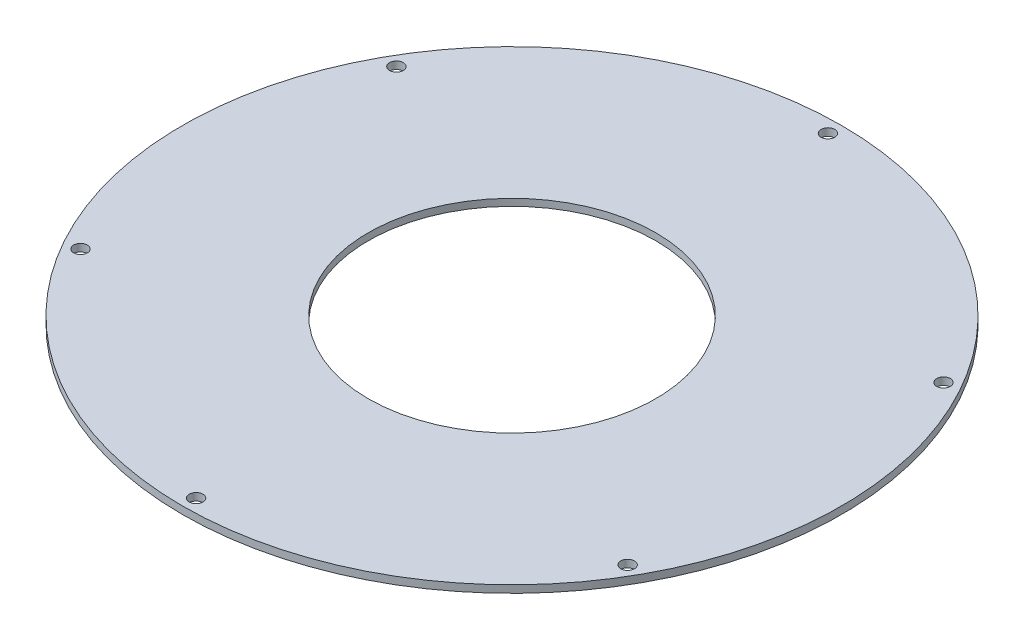
ISO-10303-21;
HEADER;
FILE_DESCRIPTION(('STEP AP214'),'2;1');
FILE_NAME('part.step','',(''),(''),'','','');
FILE_SCHEMA(('AUTOMOTIVE_DESIGN { 1 0 10303 214 1 1 1 1 }'));
ENDSEC;
DATA;
#1=APPLICATION_CONTEXT('core data for automotive mechanical design processes');
#2=APPLICATION_PROTOCOL_DEFINITION('international standard','automotive_design',2000,#1);
#3=PRODUCT_CONTEXT('',#1,'mechanical');
#4=PRODUCT('Part','Part','',(#3));
#5=PRODUCT_RELATED_PRODUCT_CATEGORY('part','',(#4));
#6=PRODUCT_DEFINITION_FORMATION('','',#4);
#7=PRODUCT_DEFINITION_CONTEXT('part definition',#1,'design');
#8=PRODUCT_DEFINITION('design','',#6,#7);
#9=PRODUCT_DEFINITION_SHAPE('','',#8);
#10=(LENGTH_UNIT() NAMED_UNIT(*) SI_UNIT(.MILLI.,.METRE.));
#11=(NAMED_UNIT(*) PLANE_ANGLE_UNIT() SI_UNIT($,.RADIAN.));
#12=(NAMED_UNIT(*) SI_UNIT($,.STERADIAN.) SOLID_ANGLE_UNIT());
#13=UNCERTAINTY_MEASURE_WITH_UNIT(LENGTH_MEASURE(1.E-05),#10,'distance_accuracy_value','');
#14=(GEOMETRIC_REPRESENTATION_CONTEXT(3) GLOBAL_UNCERTAINTY_ASSIGNED_CONTEXT((#13)) GLOBAL_UNIT_ASSIGNED_CONTEXT((#10,
#11,#12)) REPRESENTATION_CONTEXT('',''));
#15=CARTESIAN_POINT('',(0.,0.,0.));
#16=DIRECTION('',(0.,0.,1.));
#17=DIRECTION('',(1.,0.,0.));
#18=AXIS2_PLACEMENT_3D('',#15,#16,#17);
#19=CARTESIAN_POINT('',(0.,0.,0.));
#20=DIRECTION('',(0.,1.,0.));
#21=DIRECTION('',(0.,0.,1.));
#22=AXIS2_PLACEMENT_3D('',#19,#20,#21);
#23=PLANE('',#22);
#24=CARTESIAN_POINT('',(0.,0.,0.));
#25=DIRECTION('',(0.,1.,0.));
#26=DIRECTION('',(0.,0.,1.));
#27=AXIS2_PLACEMENT_3D('',#24,#25,#26);
#28=CIRCLE('',#27,70.8759);
#29=CARTESIAN_POINT('',(0.,0.,70.8759));
#30=VERTEX_POINT('',#29);
#31=EDGE_CURVE('E43',#30,#30,#28,.T.);
#32=ORIENTED_EDGE('',*,*,#31,.F.);
#33=EDGE_LOOP('',(#32));
#34=FACE_BOUND('',#33,.T.);
#35=CARTESIAN_POINT('',(-58.835990581037,0.,-33.968975));
#36=DIRECTION('',(0.,1.,0.));
#37=DIRECTION('',(0.,0.,1.));
#38=AXIS2_PLACEMENT_3D('',#35,#36,#37);
#39=CIRCLE('',#38,1.4732);
#40=CARTESIAN_POINT('',(-58.835990581037,0.,-32.495775));
#41=VERTEX_POINT('',#40);
#42=EDGE_CURVE('E71',#41,#41,#39,.T.);
#43=ORIENTED_EDGE('',*,*,#42,.T.);
#44=EDGE_LOOP('',(#43));
#45=FACE_BOUND('',#44,.T.);
#46=CARTESIAN_POINT('',(-58.835990581037,0.,33.968975));
#47=DIRECTION('',(0.,1.,0.));
#48=DIRECTION('',(0.,0.,1.));
#49=AXIS2_PLACEMENT_3D('',#46,#47,#48);
#50=CIRCLE('',#49,1.4732);
#51=CARTESIAN_POINT('',(-58.835990581037,0.,35.442175));
#52=VERTEX_POINT('',#51);
#53=EDGE_CURVE('E69',#52,#52,#50,.T.);
#54=ORIENTED_EDGE('',*,*,#53,.T.);
#55=EDGE_LOOP('',(#54));
#56=FACE_BOUND('',#55,.T.);
#57=CARTESIAN_POINT('',(0.,0.,67.93795));
#58=DIRECTION('',(0.,1.,0.));
#59=DIRECTION('',(0.,0.,1.));
#60=AXIS2_PLACEMENT_3D('',#57,#58,#59);
#61=CIRCLE('',#60,1.4732);
#62=CARTESIAN_POINT('',(0.,0.,69.41115));
#63=VERTEX_POINT('',#62);
#64=EDGE_CURVE('E66',#63,#63,#61,.T.);
#65=ORIENTED_EDGE('',*,*,#64,.T.);
#66=EDGE_LOOP('',(#65));
#67=FACE_BOUND('',#66,.T.);
#68=CARTESIAN_POINT('',(58.835990581037,0.,33.968975));
#69=DIRECTION('',(0.,1.,0.));
#70=DIRECTION('',(0.,0.,1.));
#71=AXIS2_PLACEMENT_3D('',#68,#69,#70);
#72=CIRCLE('',#71,1.47320000000002);
#73=CARTESIAN_POINT('',(58.835990581037,0.,35.442175));
#74=VERTEX_POINT('',#73);
#75=EDGE_CURVE('E63',#74,#74,#72,.T.);
#76=ORIENTED_EDGE('',*,*,#75,.T.);
#77=EDGE_LOOP('',(#76));
#78=FACE_BOUND('',#77,.T.);
#79=CARTESIAN_POINT('',(58.835990581037,0.,-33.968975));
#80=DIRECTION('',(0.,1.,0.));
#81=DIRECTION('',(0.,0.,1.));
#82=AXIS2_PLACEMENT_3D('',#79,#80,#81);
#83=CIRCLE('',#82,1.4732);
#84=CARTESIAN_POINT('',(58.835990581037,0.,-32.495775));
#85=VERTEX_POINT('',#84);
#86=EDGE_CURVE('E59',#85,#85,#83,.T.);
#87=ORIENTED_EDGE('',*,*,#86,.T.);
#88=EDGE_LOOP('',(#87));
#89=FACE_BOUND('',#88,.T.);
#90=CARTESIAN_POINT('',(0.,0.,-67.93795));
#91=DIRECTION('',(0.,1.,0.));
#92=DIRECTION('',(0.,0.,1.));
#93=AXIS2_PLACEMENT_3D('',#90,#91,#92);
#94=CIRCLE('',#93,1.4732);
#95=CARTESIAN_POINT('',(0.,0.,-66.46475));
#96=VERTEX_POINT('',#95);
#97=EDGE_CURVE('E56',#96,#96,#94,.T.);
#98=ORIENTED_EDGE('',*,*,#97,.T.);
#99=EDGE_LOOP('',(#98));
#100=FACE_BOUND('',#99,.T.);
#101=CARTESIAN_POINT('',(0.,0.,0.));
#102=DIRECTION('',(0.,1.,0.));
#103=DIRECTION('',(0.,0.,1.));
#104=AXIS2_PLACEMENT_3D('',#101,#102,#103);
#105=CIRCLE('',#104,65.);
#106=CARTESIAN_POINT('',(0.,0.,65.));
#107=VERTEX_POINT('',#106);
#108=EDGE_CURVE('E88',#107,#107,#105,.T.);
#109=ORIENTED_EDGE('',*,*,#108,.T.);
#110=EDGE_LOOP('',(#109));
#111=FACE_BOUND('',#110,.T.);
#112=ADVANCED_FACE('F39',(#34,#45,#56,#67,#78,#89,#100,#111),#23,.F.);
#113=CARTESIAN_POINT('',(0.,1.6,0.));
#114=DIRECTION('',(0.,-1.,0.));
#115=DIRECTION('',(0.,0.,-1.));
#116=AXIS2_PLACEMENT_3D('',#113,#114,#115);
#117=CYLINDRICAL_SURFACE('',#116,70.8759);
#118=CARTESIAN_POINT('',(0.,1.6,0.));
#119=DIRECTION('',(0.,1.,0.));
#120=DIRECTION('',(0.,0.,1.));
#121=AXIS2_PLACEMENT_3D('',#118,#119,#120);
#122=CIRCLE('',#121,70.8759);
#123=CARTESIAN_POINT('',(0.,1.6,70.8759));
#124=VERTEX_POINT('',#123);
#125=EDGE_CURVE('E47',#124,#124,#122,.T.);
#126=ORIENTED_EDGE('',*,*,#125,.F.);
#127=EDGE_LOOP('',(#126));
#128=FACE_BOUND('',#127,.T.);
#129=ORIENTED_EDGE('',*,*,#31,.T.);
#130=EDGE_LOOP('',(#129));
#131=FACE_BOUND('',#130,.T.);
#132=ADVANCED_FACE('F114',(#128,#131),#117,.T.);
#133=CARTESIAN_POINT('',(-58.835990581037,1.6,-33.968975));
#134=DIRECTION('',(0.,-1.,0.));
#135=DIRECTION('',(0.,0.,-1.));
#136=AXIS2_PLACEMENT_3D('',#133,#134,#135);
#137=CYLINDRICAL_SURFACE('',#136,1.4732);
#138=CARTESIAN_POINT('',(-58.835990581037,1.6,-33.968975));
#139=DIRECTION('',(0.,1.,0.));
#140=DIRECTION('',(0.,0.,1.));
#141=AXIS2_PLACEMENT_3D('',#138,#139,#140);
#142=CIRCLE('',#141,1.4732);
#143=CARTESIAN_POINT('',(-58.835990581037,1.6,-32.495775));
#144=VERTEX_POINT('',#143);
#145=EDGE_CURVE('E52',#144,#144,#142,.T.);
#146=ORIENTED_EDGE('',*,*,#145,.T.);
#147=EDGE_LOOP('',(#146));
#148=FACE_BOUND('',#147,.T.);
#149=ORIENTED_EDGE('',*,*,#42,.F.);
#150=EDGE_LOOP('',(#149));
#151=FACE_BOUND('',#150,.T.);
#152=ADVANCED_FACE('F101',(#148,#151),#137,.F.);
#153=CARTESIAN_POINT('',(-58.835990581037,1.6,33.968975));
#154=DIRECTION('',(0.,-1.,0.));
#155=DIRECTION('',(0.,0.,-1.));
#156=AXIS2_PLACEMENT_3D('',#153,#154,#155);
#157=CYLINDRICAL_SURFACE('',#156,1.4732);
#158=CARTESIAN_POINT('',(-58.835990581037,1.6,33.968975));
#159=DIRECTION('',(0.,1.,0.));
#160=DIRECTION('',(0.,0.,1.));
#161=AXIS2_PLACEMENT_3D('',#158,#159,#160);
#162=CIRCLE('',#161,1.4732);
#163=CARTESIAN_POINT('',(-58.835990581037,1.6,35.442175));
#164=VERTEX_POINT('',#163);
#165=EDGE_CURVE('E96',#164,#164,#162,.T.);
#166=ORIENTED_EDGE('',*,*,#165,.T.);
#167=EDGE_LOOP('',(#166));
#168=FACE_BOUND('',#167,.T.);
#169=ORIENTED_EDGE('',*,*,#53,.F.);
#170=EDGE_LOOP('',(#169));
#171=FACE_BOUND('',#170,.T.);
#172=ADVANCED_FACE('F121',(#168,#171),#157,.F.);
#173=CARTESIAN_POINT('',(0.,1.6,67.93795));
#174=DIRECTION('',(0.,-1.,0.));
#175=DIRECTION('',(0.,0.,-1.));
#176=AXIS2_PLACEMENT_3D('',#173,#174,#175);
#177=CYLINDRICAL_SURFACE('',#176,1.4732);
#178=CARTESIAN_POINT('',(0.,1.6,67.93795));
#179=DIRECTION('',(0.,1.,0.));
#180=DIRECTION('',(0.,0.,1.));
#181=AXIS2_PLACEMENT_3D('',#178,#179,#180);
#182=CIRCLE('',#181,1.4732);
#183=CARTESIAN_POINT('',(0.,1.6,69.41115));
#184=VERTEX_POINT('',#183);
#185=EDGE_CURVE('E93',#184,#184,#182,.T.);
#186=ORIENTED_EDGE('',*,*,#185,.T.);
#187=EDGE_LOOP('',(#186));
#188=FACE_BOUND('',#187,.T.);
#189=ORIENTED_EDGE('',*,*,#64,.F.);
#190=EDGE_LOOP('',(#189));
#191=FACE_BOUND('',#190,.T.);
#192=ADVANCED_FACE('F129',(#188,#191),#177,.F.);
#193=CARTESIAN_POINT('',(58.835990581037,1.6,33.968975));
#194=DIRECTION('',(0.,-1.,0.));
#195=DIRECTION('',(0.,0.,-1.));
#196=AXIS2_PLACEMENT_3D('',#193,#194,#195);
#197=CYLINDRICAL_SURFACE('',#196,1.47320000000002);
#198=CARTESIAN_POINT('',(58.835990581037,1.6,33.968975));
#199=DIRECTION('',(0.,1.,0.));
#200=DIRECTION('',(0.,0.,1.));
#201=AXIS2_PLACEMENT_3D('',#198,#199,#200);
#202=CIRCLE('',#201,1.47320000000002);
#203=CARTESIAN_POINT('',(58.835990581037,1.6,35.442175));
#204=VERTEX_POINT('',#203);
#205=EDGE_CURVE('E85',#204,#204,#202,.T.);
#206=ORIENTED_EDGE('',*,*,#205,.T.);
#207=EDGE_LOOP('',(#206));
#208=FACE_BOUND('',#207,.T.);
#209=ORIENTED_EDGE('',*,*,#75,.F.);
#210=EDGE_LOOP('',(#209));
#211=FACE_BOUND('',#210,.T.);
#212=ADVANCED_FACE('F133',(#208,#211),#197,.F.);
#213=CARTESIAN_POINT('',(58.835990581037,1.6,-33.968975));
#214=DIRECTION('',(0.,-1.,0.));
#215=DIRECTION('',(0.,0.,-1.));
#216=AXIS2_PLACEMENT_3D('',#213,#214,#215);
#217=CYLINDRICAL_SURFACE('',#216,1.4732);
#218=CARTESIAN_POINT('',(58.835990581037,1.6,-33.968975));
#219=DIRECTION('',(0.,1.,0.));
#220=DIRECTION('',(0.,0.,1.));
#221=AXIS2_PLACEMENT_3D('',#218,#219,#220);
#222=CIRCLE('',#221,1.4732);
#223=CARTESIAN_POINT('',(58.835990581037,1.6,-32.495775));
#224=VERTEX_POINT('',#223);
#225=EDGE_CURVE('E80',#224,#224,#222,.T.);
#226=ORIENTED_EDGE('',*,*,#225,.T.);
#227=EDGE_LOOP('',(#226));
#228=FACE_BOUND('',#227,.T.);
#229=ORIENTED_EDGE('',*,*,#86,.F.);
#230=EDGE_LOOP('',(#229));
#231=FACE_BOUND('',#230,.T.);
#232=ADVANCED_FACE('F136',(#228,#231),#217,.F.);
#233=CARTESIAN_POINT('',(0.,1.6,-67.93795));
#234=DIRECTION('',(0.,-1.,0.));
#235=DIRECTION('',(0.,0.,-1.));
#236=AXIS2_PLACEMENT_3D('',#233,#234,#235);
#237=CYLINDRICAL_SURFACE('',#236,1.4732);
#238=CARTESIAN_POINT('',(0.,1.6,-67.93795));
#239=DIRECTION('',(0.,1.,0.));
#240=DIRECTION('',(0.,0.,1.));
#241=AXIS2_PLACEMENT_3D('',#238,#239,#240);
#242=CIRCLE('',#241,1.4732);
#243=CARTESIAN_POINT('',(0.,1.6,-66.46475));
#244=VERTEX_POINT('',#243);
#245=EDGE_CURVE('E76',#244,#244,#242,.T.);
#246=ORIENTED_EDGE('',*,*,#245,.T.);
#247=EDGE_LOOP('',(#246));
#248=FACE_BOUND('',#247,.T.);
#249=ORIENTED_EDGE('',*,*,#97,.F.);
#250=EDGE_LOOP('',(#249));
#251=FACE_BOUND('',#250,.T.);
#252=ADVANCED_FACE('F41',(#248,#251),#237,.F.);
#253=CARTESIAN_POINT('',(0.,1.6,0.));
#254=DIRECTION('',(0.,-1.,0.));
#255=DIRECTION('',(0.,0.,-1.));
#256=AXIS2_PLACEMENT_3D('',#253,#254,#255);
#257=CYLINDRICAL_SURFACE('',#256,30.925);
#258=CARTESIAN_POINT('',(0.,0.1,0.));
#259=DIRECTION('',(0.,1.,0.));
#260=DIRECTION('',(0.,0.,1.));
#261=AXIS2_PLACEMENT_3D('',#258,#259,#260);
#262=CIRCLE('',#261,30.925);
#263=CARTESIAN_POINT('',(0.,0.1,30.925));
#264=VERTEX_POINT('',#263);
#265=EDGE_CURVE('E60',#264,#264,#262,.T.);
#266=ORIENTED_EDGE('',*,*,#265,.F.);
#267=EDGE_LOOP('',(#266));
#268=FACE_BOUND('',#267,.T.);
#269=CARTESIAN_POINT('',(0.,1.6,0.));
#270=DIRECTION('',(0.,1.,0.));
#271=DIRECTION('',(0.,0.,1.));
#272=AXIS2_PLACEMENT_3D('',#269,#270,#271);
#273=CIRCLE('',#272,30.925);
#274=CARTESIAN_POINT('',(0.,1.6,30.925));
#275=VERTEX_POINT('',#274);
#276=EDGE_CURVE('E10',#275,#275,#273,.T.);
#277=ORIENTED_EDGE('',*,*,#276,.T.);
#278=EDGE_LOOP('',(#277));
#279=FACE_BOUND('',#278,.T.);
#280=ADVANCED_FACE('F108',(#268,#279),#257,.F.);
#281=CARTESIAN_POINT('',(0.,1.6,0.));
#282=DIRECTION('',(0.,1.,0.));
#283=DIRECTION('',(0.,0.,1.));
#284=AXIS2_PLACEMENT_3D('',#281,#282,#283);
#285=PLANE('',#284);
#286=ORIENTED_EDGE('',*,*,#245,.F.);
#287=EDGE_LOOP('',(#286));
#288=FACE_BOUND('',#287,.T.);
#289=ORIENTED_EDGE('',*,*,#225,.F.);
#290=EDGE_LOOP('',(#289));
#291=FACE_BOUND('',#290,.T.);
#292=ORIENTED_EDGE('',*,*,#205,.F.);
#293=EDGE_LOOP('',(#292));
#294=FACE_BOUND('',#293,.T.);
#295=ORIENTED_EDGE('',*,*,#185,.F.);
#296=EDGE_LOOP('',(#295));
#297=FACE_BOUND('',#296,.T.);
#298=ORIENTED_EDGE('',*,*,#165,.F.);
#299=EDGE_LOOP('',(#298));
#300=FACE_BOUND('',#299,.T.);
#301=ORIENTED_EDGE('',*,*,#145,.F.);
#302=EDGE_LOOP('',(#301));
#303=FACE_BOUND('',#302,.T.);
#304=ORIENTED_EDGE('',*,*,#125,.T.);
#305=EDGE_LOOP('',(#304));
#306=FACE_BOUND('',#305,.T.);
#307=ORIENTED_EDGE('',*,*,#276,.F.);
#308=EDGE_LOOP('',(#307));
#309=FACE_BOUND('',#308,.T.);
#310=ADVANCED_FACE('F104',(#288,#291,#294,#297,#300,#303,#306,#309),#285,.T.);
#311=CARTESIAN_POINT('',(0.,0.1,0.));
#312=DIRECTION('',(0.,-1.,0.));
#313=DIRECTION('',(0.,0.,-1.));
#314=AXIS2_PLACEMENT_3D('',#311,#312,#313);
#315=CYLINDRICAL_SURFACE('',#314,65.);
#316=CARTESIAN_POINT('',(0.,0.1,0.));
#317=DIRECTION('',(0.,1.,0.));
#318=DIRECTION('',(0.,0.,1.));
#319=AXIS2_PLACEMENT_3D('',#316,#317,#318);
#320=CIRCLE('',#319,65.);
#321=CARTESIAN_POINT('',(0.,0.1,65.));
#322=VERTEX_POINT('',#321);
#323=EDGE_CURVE('E153',#322,#322,#320,.T.);
#324=ORIENTED_EDGE('',*,*,#323,.T.);
#325=EDGE_LOOP('',(#324));
#326=FACE_BOUND('',#325,.T.);
#327=ORIENTED_EDGE('',*,*,#108,.F.);
#328=EDGE_LOOP('',(#327));
#329=FACE_BOUND('',#328,.T.);
#330=ADVANCED_FACE('F107',(#326,#329),#315,.F.);
#331=CARTESIAN_POINT('',(0.,0.1,0.));
#332=DIRECTION('',(0.,1.,0.));
#333=DIRECTION('',(0.,0.,1.));
#334=AXIS2_PLACEMENT_3D('',#331,#332,#333);
#335=PLANE('',#334);
#336=ORIENTED_EDGE('',*,*,#323,.F.);
#337=EDGE_LOOP('',(#336));
#338=FACE_BOUND('',#337,.T.);
#339=ORIENTED_EDGE('',*,*,#265,.T.);
#340=EDGE_LOOP('',(#339));
#341=FACE_BOUND('',#340,.T.);
#342=ADVANCED_FACE('F161',(#338,#341),#335,.F.);
#343=CLOSED_SHELL('',(#112,#132,#152,#172,#192,#212,#232,#252,#280,#310,#330,#342));
#344=MANIFOLD_SOLID_BREP('B2',#343);
#345=ADVANCED_BREP_SHAPE_REPRESENTATION('',(#18,#344),#14);
#346=SHAPE_DEFINITION_REPRESENTATION(#9,#345);
ENDSEC;
END-ISO-10303-21;
